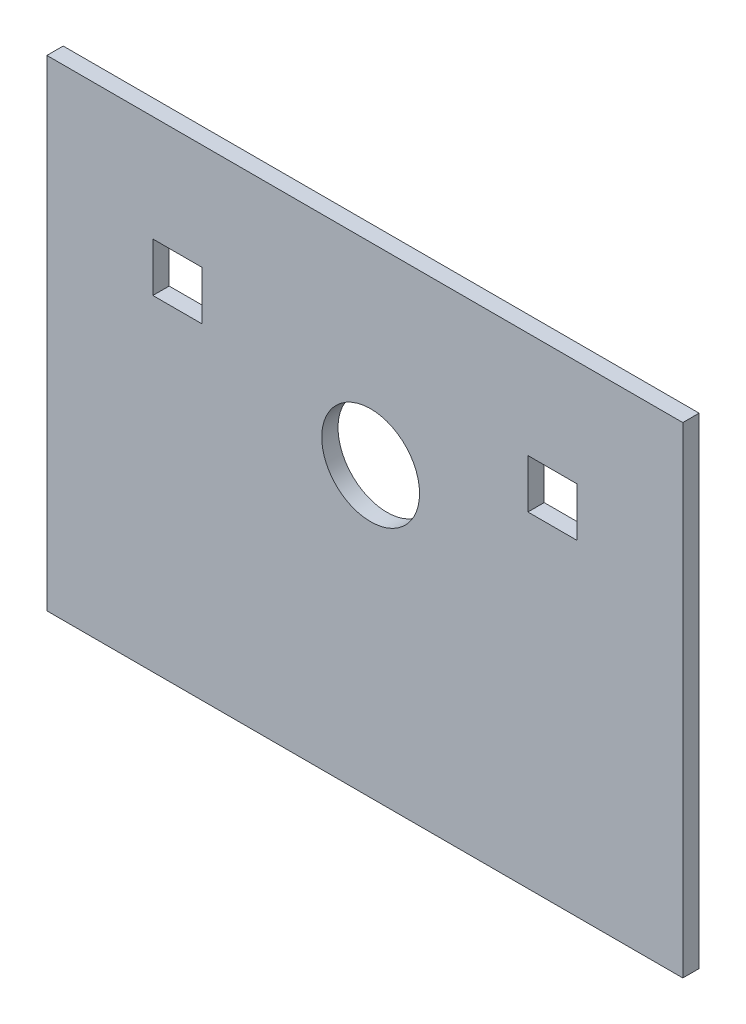
ISO-10303-21;
HEADER;
FILE_DESCRIPTION(('STEP AP214'),'2;1');
FILE_NAME('part.step','',(''),(''),'','','');
FILE_SCHEMA(('AUTOMOTIVE_DESIGN { 1 0 10303 214 1 1 1 1 }'));
ENDSEC;
DATA;
#1=APPLICATION_CONTEXT('core data for automotive mechanical design processes');
#2=APPLICATION_PROTOCOL_DEFINITION('international standard','automotive_design',2000,#1);
#3=PRODUCT_CONTEXT('',#1,'mechanical');
#4=PRODUCT('Part','Part','',(#3));
#5=PRODUCT_RELATED_PRODUCT_CATEGORY('part','',(#4));
#6=PRODUCT_DEFINITION_FORMATION('','',#4);
#7=PRODUCT_DEFINITION_CONTEXT('part definition',#1,'design');
#8=PRODUCT_DEFINITION('design','',#6,#7);
#9=PRODUCT_DEFINITION_SHAPE('','',#8);
#10=(LENGTH_UNIT() NAMED_UNIT(*) SI_UNIT(.MILLI.,.METRE.));
#11=(NAMED_UNIT(*) PLANE_ANGLE_UNIT() SI_UNIT($,.RADIAN.));
#12=(NAMED_UNIT(*) SI_UNIT($,.STERADIAN.) SOLID_ANGLE_UNIT());
#13=UNCERTAINTY_MEASURE_WITH_UNIT(LENGTH_MEASURE(1.E-05),#10,'distance_accuracy_value','');
#14=(GEOMETRIC_REPRESENTATION_CONTEXT(3) GLOBAL_UNCERTAINTY_ASSIGNED_CONTEXT((#13)) GLOBAL_UNIT_ASSIGNED_CONTEXT((#10,
#11,#12)) REPRESENTATION_CONTEXT('',''));
#15=CARTESIAN_POINT('',(0.,0.,0.));
#16=DIRECTION('',(0.,0.,1.));
#17=DIRECTION('',(1.,0.,0.));
#18=AXIS2_PLACEMENT_3D('',#15,#16,#17);
#19=CARTESIAN_POINT('',(39.,-29.5,-2.));
#20=DIRECTION('',(1.,0.,0.));
#21=DIRECTION('',(0.,0.,-1.));
#22=AXIS2_PLACEMENT_3D('',#19,#20,#21);
#23=PLANE('',#22);
#24=DIRECTION('',(0.,1.,0.));
#25=VECTOR('',#24,1.);
#26=CARTESIAN_POINT('',(39.,-29.5,0.));
#27=LINE('',#26,#25);
#28=CARTESIAN_POINT('',(39.,-29.5,0.));
#29=VERTEX_POINT('',#28);
#30=CARTESIAN_POINT('',(39.,29.5,0.));
#31=VERTEX_POINT('',#30);
#32=EDGE_CURVE('E194',#29,#31,#27,.T.);
#33=ORIENTED_EDGE('',*,*,#32,.F.);
#34=DIRECTION('',(0.,0.,1.));
#35=VECTOR('',#34,1.);
#36=CARTESIAN_POINT('',(39.,-29.5,-2.));
#37=LINE('',#36,#35);
#38=CARTESIAN_POINT('',(39.,-29.5,-2.));
#39=VERTEX_POINT('',#38);
#40=EDGE_CURVE('E11',#39,#29,#37,.T.);
#41=ORIENTED_EDGE('',*,*,#40,.F.);
#42=DIRECTION('',(0.,1.,0.));
#43=VECTOR('',#42,1.);
#44=CARTESIAN_POINT('',(39.,-29.5,-2.));
#45=LINE('',#44,#43);
#46=CARTESIAN_POINT('',(39.,29.5,-2.));
#47=VERTEX_POINT('',#46);
#48=EDGE_CURVE('E201',#39,#47,#45,.T.);
#49=ORIENTED_EDGE('',*,*,#48,.T.);
#50=DIRECTION('',(0.,0.,1.));
#51=VECTOR('',#50,1.);
#52=CARTESIAN_POINT('',(39.,29.5,-2.));
#53=LINE('',#52,#51);
#54=EDGE_CURVE('E42',#47,#31,#53,.T.);
#55=ORIENTED_EDGE('',*,*,#54,.T.);
#56=EDGE_LOOP('',(#33,#41,#49,#55));
#57=FACE_BOUND('',#56,.T.);
#58=ADVANCED_FACE('F39',(#57),#23,.T.);
#59=CARTESIAN_POINT('',(-39.,-29.5,-2.));
#60=DIRECTION('',(0.,-1.,0.));
#61=DIRECTION('',(0.,0.,-1.));
#62=AXIS2_PLACEMENT_3D('',#59,#60,#61);
#63=PLANE('',#62);
#64=DIRECTION('',(1.,0.,0.));
#65=VECTOR('',#64,1.);
#66=CARTESIAN_POINT('',(-39.,-29.5,0.));
#67=LINE('',#66,#65);
#68=CARTESIAN_POINT('',(-39.,-29.5,0.));
#69=VERTEX_POINT('',#68);
#70=EDGE_CURVE('E205',#69,#29,#67,.T.);
#71=ORIENTED_EDGE('',*,*,#70,.F.);
#72=DIRECTION('',(0.,0.,1.));
#73=VECTOR('',#72,1.);
#74=CARTESIAN_POINT('',(-39.,-29.5,-2.));
#75=LINE('',#74,#73);
#76=CARTESIAN_POINT('',(-39.,-29.5,-2.));
#77=VERTEX_POINT('',#76);
#78=EDGE_CURVE('E47',#77,#69,#75,.T.);
#79=ORIENTED_EDGE('',*,*,#78,.F.);
#80=DIRECTION('',(1.,0.,0.));
#81=VECTOR('',#80,1.);
#82=CARTESIAN_POINT('',(-39.,-29.5,-2.));
#83=LINE('',#82,#81);
#84=EDGE_CURVE('E211',#77,#39,#83,.T.);
#85=ORIENTED_EDGE('',*,*,#84,.T.);
#86=ORIENTED_EDGE('',*,*,#40,.T.);
#87=EDGE_LOOP('',(#71,#79,#85,#86));
#88=FACE_BOUND('',#87,.T.);
#89=ADVANCED_FACE('F237',(#88),#63,.T.);
#90=CARTESIAN_POINT('',(-39.,-29.5,-2.));
#91=DIRECTION('',(-1.,0.,0.));
#92=DIRECTION('',(0.,0.,1.));
#93=AXIS2_PLACEMENT_3D('',#90,#91,#92);
#94=PLANE('',#93);
#95=DIRECTION('',(0.,-1.,0.));
#96=VECTOR('',#95,1.);
#97=CARTESIAN_POINT('',(-39.,-29.5,0.));
#98=LINE('',#97,#96);
#99=CARTESIAN_POINT('',(-39.,29.5,0.));
#100=VERTEX_POINT('',#99);
#101=EDGE_CURVE('E219',#100,#69,#98,.T.);
#102=ORIENTED_EDGE('',*,*,#101,.F.);
#103=DIRECTION('',(0.,0.,1.));
#104=VECTOR('',#103,1.);
#105=CARTESIAN_POINT('',(-39.,29.5,-2.));
#106=LINE('',#105,#104);
#107=CARTESIAN_POINT('',(-39.,29.5,-2.));
#108=VERTEX_POINT('',#107);
#109=EDGE_CURVE('E224',#108,#100,#106,.T.);
#110=ORIENTED_EDGE('',*,*,#109,.F.);
#111=DIRECTION('',(0.,-1.,0.));
#112=VECTOR('',#111,1.);
#113=CARTESIAN_POINT('',(-39.,-29.5,-2.));
#114=LINE('',#113,#112);
#115=EDGE_CURVE('E208',#108,#77,#114,.T.);
#116=ORIENTED_EDGE('',*,*,#115,.T.);
#117=ORIENTED_EDGE('',*,*,#78,.T.);
#118=EDGE_LOOP('',(#102,#110,#116,#117));
#119=FACE_BOUND('',#118,.T.);
#120=ADVANCED_FACE('F242',(#119),#94,.T.);
#121=CARTESIAN_POINT('',(-39.,29.5,-2.));
#122=DIRECTION('',(0.,1.,0.));
#123=DIRECTION('',(0.,0.,1.));
#124=AXIS2_PLACEMENT_3D('',#121,#122,#123);
#125=PLANE('',#124);
#126=DIRECTION('',(-1.,0.,0.));
#127=VECTOR('',#126,1.);
#128=CARTESIAN_POINT('',(-39.,29.5,0.));
#129=LINE('',#128,#127);
#130=EDGE_CURVE('E216',#31,#100,#129,.T.);
#131=ORIENTED_EDGE('',*,*,#130,.F.);
#132=ORIENTED_EDGE('',*,*,#54,.F.);
#133=DIRECTION('',(-1.,0.,0.));
#134=VECTOR('',#133,1.);
#135=CARTESIAN_POINT('',(-39.,29.5,-2.));
#136=LINE('',#135,#134);
#137=EDGE_CURVE('E204',#47,#108,#136,.T.);
#138=ORIENTED_EDGE('',*,*,#137,.T.);
#139=ORIENTED_EDGE('',*,*,#109,.T.);
#140=EDGE_LOOP('',(#131,#132,#138,#139));
#141=FACE_BOUND('',#140,.T.);
#142=ADVANCED_FACE('F232',(#141),#125,.T.);
#143=CARTESIAN_POINT('',(0.,0.,-2.));
#144=DIRECTION('',(0.,0.,-1.));
#145=DIRECTION('',(-1.,0.,0.));
#146=AXIS2_PLACEMENT_3D('',#143,#144,#145);
#147=PLANE('',#146);
#148=CARTESIAN_POINT('',(0.71,5.82000000000001,-2.));
#149=DIRECTION('',(0.,0.,1.));
#150=DIRECTION('',(1.,0.,0.));
#151=AXIS2_PLACEMENT_3D('',#148,#149,#150);
#152=CIRCLE('',#151,6.0003838266872);
#153=CARTESIAN_POINT('',(6.7103838266872,5.82000000000001,-2.));
#154=VERTEX_POINT('',#153);
#155=EDGE_CURVE('E159',#154,#154,#152,.T.);
#156=ORIENTED_EDGE('',*,*,#155,.T.);
#157=EDGE_LOOP('',(#156));
#158=FACE_BOUND('',#157,.T.);
#159=DIRECTION('',(0.,1.,0.));
#160=VECTOR('',#159,1.);
#161=CARTESIAN_POINT('',(26.,10.5,-2.));
#162=LINE('',#161,#160);
#163=CARTESIAN_POINT('',(26.,10.5,-2.));
#164=VERTEX_POINT('',#163);
#165=CARTESIAN_POINT('',(26.,16.5,-2.));
#166=VERTEX_POINT('',#165);
#167=EDGE_CURVE('E130',#164,#166,#162,.T.);
#168=ORIENTED_EDGE('',*,*,#167,.T.);
#169=DIRECTION('',(-1.,0.,0.));
#170=VECTOR('',#169,1.);
#171=CARTESIAN_POINT('',(20.,16.5,-2.));
#172=LINE('',#171,#170);
#173=CARTESIAN_POINT('',(20.,16.5,-2.));
#174=VERTEX_POINT('',#173);
#175=EDGE_CURVE('E139',#166,#174,#172,.T.);
#176=ORIENTED_EDGE('',*,*,#175,.T.);
#177=DIRECTION('',(0.,-1.,0.));
#178=VECTOR('',#177,1.);
#179=CARTESIAN_POINT('',(20.,10.5,-2.));
#180=LINE('',#179,#178);
#181=CARTESIAN_POINT('',(20.,10.5,-2.));
#182=VERTEX_POINT('',#181);
#183=EDGE_CURVE('E55',#174,#182,#180,.T.);
#184=ORIENTED_EDGE('',*,*,#183,.T.);
#185=DIRECTION('',(1.,0.,0.));
#186=VECTOR('',#185,1.);
#187=CARTESIAN_POINT('',(20.,10.5,-2.));
#188=LINE('',#187,#186);
#189=EDGE_CURVE('E136',#182,#164,#188,.T.);
#190=ORIENTED_EDGE('',*,*,#189,.T.);
#191=EDGE_LOOP('',(#168,#176,#184,#190));
#192=FACE_BOUND('',#191,.T.);
#193=DIRECTION('',(0.,1.,0.));
#194=VECTOR('',#193,1.);
#195=CARTESIAN_POINT('',(-20.,10.5,-2.));
#196=LINE('',#195,#194);
#197=CARTESIAN_POINT('',(-20.,10.5,-2.));
#198=VERTEX_POINT('',#197);
#199=CARTESIAN_POINT('',(-20.,16.5,-2.));
#200=VERTEX_POINT('',#199);
#201=EDGE_CURVE('E169',#198,#200,#196,.T.);
#202=ORIENTED_EDGE('',*,*,#201,.T.);
#203=DIRECTION('',(-1.,0.,0.));
#204=VECTOR('',#203,1.);
#205=CARTESIAN_POINT('',(-26.,16.5,-2.));
#206=LINE('',#205,#204);
#207=CARTESIAN_POINT('',(-26.,16.5,-2.));
#208=VERTEX_POINT('',#207);
#209=EDGE_CURVE('E172',#200,#208,#206,.T.);
#210=ORIENTED_EDGE('',*,*,#209,.T.);
#211=DIRECTION('',(0.,-1.,0.));
#212=VECTOR('',#211,1.);
#213=CARTESIAN_POINT('',(-26.,10.5,-2.));
#214=LINE('',#213,#212);
#215=CARTESIAN_POINT('',(-26.,10.5,-2.));
#216=VERTEX_POINT('',#215);
#217=EDGE_CURVE('E176',#208,#216,#214,.T.);
#218=ORIENTED_EDGE('',*,*,#217,.T.);
#219=DIRECTION('',(1.,0.,0.));
#220=VECTOR('',#219,1.);
#221=CARTESIAN_POINT('',(-26.,10.5,-2.));
#222=LINE('',#221,#220);
#223=EDGE_CURVE('E179',#216,#198,#222,.T.);
#224=ORIENTED_EDGE('',*,*,#223,.T.);
#225=EDGE_LOOP('',(#202,#210,#218,#224));
#226=FACE_BOUND('',#225,.T.);
#227=ORIENTED_EDGE('',*,*,#48,.F.);
#228=ORIENTED_EDGE('',*,*,#84,.F.);
#229=ORIENTED_EDGE('',*,*,#115,.F.);
#230=ORIENTED_EDGE('',*,*,#137,.F.);
#231=EDGE_LOOP('',(#227,#228,#229,#230));
#232=FACE_BOUND('',#231,.T.);
#233=ADVANCED_FACE('F143',(#158,#192,#226,#232),#147,.T.);
#234=CARTESIAN_POINT('',(0.,0.,0.));
#235=DIRECTION('',(0.,0.,-1.));
#236=DIRECTION('',(-1.,0.,0.));
#237=AXIS2_PLACEMENT_3D('',#234,#235,#236);
#238=PLANE('',#237);
#239=CARTESIAN_POINT('',(0.71,5.82000000000001,0.));
#240=DIRECTION('',(0.,0.,1.));
#241=DIRECTION('',(1.,0.,0.));
#242=AXIS2_PLACEMENT_3D('',#239,#240,#241);
#243=CIRCLE('',#242,6.0003838266872);
#244=CARTESIAN_POINT('',(6.7103838266872,5.82000000000001,0.));
#245=VERTEX_POINT('',#244);
#246=EDGE_CURVE('E152',#245,#245,#243,.T.);
#247=ORIENTED_EDGE('',*,*,#246,.F.);
#248=EDGE_LOOP('',(#247));
#249=FACE_BOUND('',#248,.T.);
#250=DIRECTION('',(-1.,0.,0.));
#251=VECTOR('',#250,1.);
#252=CARTESIAN_POINT('',(20.,16.5,0.));
#253=LINE('',#252,#251);
#254=CARTESIAN_POINT('',(26.,16.5,0.));
#255=VERTEX_POINT('',#254);
#256=CARTESIAN_POINT('',(20.,16.5,0.));
#257=VERTEX_POINT('',#256);
#258=EDGE_CURVE('E158',#255,#257,#253,.T.);
#259=ORIENTED_EDGE('',*,*,#258,.F.);
#260=DIRECTION('',(0.,1.,0.));
#261=VECTOR('',#260,1.);
#262=CARTESIAN_POINT('',(26.,10.5,0.));
#263=LINE('',#262,#261);
#264=CARTESIAN_POINT('',(26.,10.5,0.));
#265=VERTEX_POINT('',#264);
#266=EDGE_CURVE('E63',#265,#255,#263,.T.);
#267=ORIENTED_EDGE('',*,*,#266,.F.);
#268=DIRECTION('',(1.,0.,0.));
#269=VECTOR('',#268,1.);
#270=CARTESIAN_POINT('',(20.,10.5,0.));
#271=LINE('',#270,#269);
#272=CARTESIAN_POINT('',(20.,10.5,0.));
#273=VERTEX_POINT('',#272);
#274=EDGE_CURVE('E146',#273,#265,#271,.T.);
#275=ORIENTED_EDGE('',*,*,#274,.F.);
#276=DIRECTION('',(0.,-1.,0.));
#277=VECTOR('',#276,1.);
#278=CARTESIAN_POINT('',(20.,10.5,0.));
#279=LINE('',#278,#277);
#280=EDGE_CURVE('E149',#257,#273,#279,.T.);
#281=ORIENTED_EDGE('',*,*,#280,.F.);
#282=EDGE_LOOP('',(#259,#267,#275,#281));
#283=FACE_BOUND('',#282,.T.);
#284=DIRECTION('',(-1.,0.,0.));
#285=VECTOR('',#284,1.);
#286=CARTESIAN_POINT('',(-26.,16.5,0.));
#287=LINE('',#286,#285);
#288=CARTESIAN_POINT('',(-20.,16.5,0.));
#289=VERTEX_POINT('',#288);
#290=CARTESIAN_POINT('',(-26.,16.5,0.));
#291=VERTEX_POINT('',#290);
#292=EDGE_CURVE('E184',#289,#291,#287,.T.);
#293=ORIENTED_EDGE('',*,*,#292,.F.);
#294=DIRECTION('',(0.,1.,0.));
#295=VECTOR('',#294,1.);
#296=CARTESIAN_POINT('',(-20.,10.5,0.));
#297=LINE('',#296,#295);
#298=CARTESIAN_POINT('',(-20.,10.5,0.));
#299=VERTEX_POINT('',#298);
#300=EDGE_CURVE('E165',#299,#289,#297,.T.);
#301=ORIENTED_EDGE('',*,*,#300,.F.);
#302=DIRECTION('',(1.,0.,0.));
#303=VECTOR('',#302,1.);
#304=CARTESIAN_POINT('',(-26.,10.5,0.));
#305=LINE('',#304,#303);
#306=CARTESIAN_POINT('',(-26.,10.5,0.));
#307=VERTEX_POINT('',#306);
#308=EDGE_CURVE('E173',#307,#299,#305,.T.);
#309=ORIENTED_EDGE('',*,*,#308,.F.);
#310=DIRECTION('',(0.,-1.,0.));
#311=VECTOR('',#310,1.);
#312=CARTESIAN_POINT('',(-26.,10.5,0.));
#313=LINE('',#312,#311);
#314=EDGE_CURVE('E187',#291,#307,#313,.T.);
#315=ORIENTED_EDGE('',*,*,#314,.F.);
#316=EDGE_LOOP('',(#293,#301,#309,#315));
#317=FACE_BOUND('',#316,.T.);
#318=ORIENTED_EDGE('',*,*,#32,.T.);
#319=ORIENTED_EDGE('',*,*,#130,.T.);
#320=ORIENTED_EDGE('',*,*,#101,.T.);
#321=ORIENTED_EDGE('',*,*,#70,.T.);
#322=EDGE_LOOP('',(#318,#319,#320,#321));
#323=FACE_BOUND('',#322,.T.);
#324=ADVANCED_FACE('F234',(#249,#283,#317,#323),#238,.F.);
#325=CARTESIAN_POINT('',(-20.,10.5,-2.));
#326=DIRECTION('',(1.,0.,0.));
#327=DIRECTION('',(0.,0.,-1.));
#328=AXIS2_PLACEMENT_3D('',#325,#326,#327);
#329=PLANE('',#328);
#330=ORIENTED_EDGE('',*,*,#300,.T.);
#331=DIRECTION('',(0.,0.,1.));
#332=VECTOR('',#331,1.);
#333=CARTESIAN_POINT('',(-20.,16.5,-2.));
#334=LINE('',#333,#332);
#335=EDGE_CURVE('E182',#200,#289,#334,.T.);
#336=ORIENTED_EDGE('',*,*,#335,.F.);
#337=ORIENTED_EDGE('',*,*,#201,.F.);
#338=DIRECTION('',(0.,0.,1.));
#339=VECTOR('',#338,1.);
#340=CARTESIAN_POINT('',(-20.,10.5,-2.));
#341=LINE('',#340,#339);
#342=EDGE_CURVE('E192',#198,#299,#341,.T.);
#343=ORIENTED_EDGE('',*,*,#342,.T.);
#344=EDGE_LOOP('',(#330,#336,#337,#343));
#345=FACE_BOUND('',#344,.T.);
#346=ADVANCED_FACE('F287',(#345),#329,.F.);
#347=CARTESIAN_POINT('',(-26.,10.5,-2.));
#348=DIRECTION('',(0.,-1.,0.));
#349=DIRECTION('',(0.,0.,-1.));
#350=AXIS2_PLACEMENT_3D('',#347,#348,#349);
#351=PLANE('',#350);
#352=ORIENTED_EDGE('',*,*,#308,.T.);
#353=ORIENTED_EDGE('',*,*,#342,.F.);
#354=ORIENTED_EDGE('',*,*,#223,.F.);
#355=DIRECTION('',(0.,0.,1.));
#356=VECTOR('',#355,1.);
#357=CARTESIAN_POINT('',(-26.,10.5,-2.));
#358=LINE('',#357,#356);
#359=EDGE_CURVE('E195',#216,#307,#358,.T.);
#360=ORIENTED_EDGE('',*,*,#359,.T.);
#361=EDGE_LOOP('',(#352,#353,#354,#360));
#362=FACE_BOUND('',#361,.T.);
#363=ADVANCED_FACE('F297',(#362),#351,.F.);
#364=CARTESIAN_POINT('',(-26.,10.5,-2.));
#365=DIRECTION('',(-1.,0.,0.));
#366=DIRECTION('',(0.,0.,1.));
#367=AXIS2_PLACEMENT_3D('',#364,#365,#366);
#368=PLANE('',#367);
#369=ORIENTED_EDGE('',*,*,#314,.T.);
#370=ORIENTED_EDGE('',*,*,#359,.F.);
#371=ORIENTED_EDGE('',*,*,#217,.F.);
#372=DIRECTION('',(0.,0.,1.));
#373=VECTOR('',#372,1.);
#374=CARTESIAN_POINT('',(-26.,16.5,-2.));
#375=LINE('',#374,#373);
#376=EDGE_CURVE('E197',#208,#291,#375,.T.);
#377=ORIENTED_EDGE('',*,*,#376,.T.);
#378=EDGE_LOOP('',(#369,#370,#371,#377));
#379=FACE_BOUND('',#378,.T.);
#380=ADVANCED_FACE('F307',(#379),#368,.F.);
#381=CARTESIAN_POINT('',(-26.,16.5,-2.));
#382=DIRECTION('',(0.,1.,0.));
#383=DIRECTION('',(0.,0.,1.));
#384=AXIS2_PLACEMENT_3D('',#381,#382,#383);
#385=PLANE('',#384);
#386=ORIENTED_EDGE('',*,*,#292,.T.);
#387=ORIENTED_EDGE('',*,*,#376,.F.);
#388=ORIENTED_EDGE('',*,*,#209,.F.);
#389=ORIENTED_EDGE('',*,*,#335,.T.);
#390=EDGE_LOOP('',(#386,#387,#388,#389));
#391=FACE_BOUND('',#390,.T.);
#392=ADVANCED_FACE('F317',(#391),#385,.F.);
#393=CARTESIAN_POINT('',(26.,10.5,-2.));
#394=DIRECTION('',(1.,0.,0.));
#395=DIRECTION('',(0.,0.,-1.));
#396=AXIS2_PLACEMENT_3D('',#393,#394,#395);
#397=PLANE('',#396);
#398=ORIENTED_EDGE('',*,*,#266,.T.);
#399=DIRECTION('',(0.,0.,1.));
#400=VECTOR('',#399,1.);
#401=CARTESIAN_POINT('',(26.,16.5,-2.));
#402=LINE('',#401,#400);
#403=EDGE_CURVE('E126',#166,#255,#402,.T.);
#404=ORIENTED_EDGE('',*,*,#403,.F.);
#405=ORIENTED_EDGE('',*,*,#167,.F.);
#406=DIRECTION('',(0.,0.,1.));
#407=VECTOR('',#406,1.);
#408=CARTESIAN_POINT('',(26.,10.5,-2.));
#409=LINE('',#408,#407);
#410=EDGE_CURVE('E163',#164,#265,#409,.T.);
#411=ORIENTED_EDGE('',*,*,#410,.T.);
#412=EDGE_LOOP('',(#398,#404,#405,#411));
#413=FACE_BOUND('',#412,.T.);
#414=ADVANCED_FACE('F128',(#413),#397,.F.);
#415=CARTESIAN_POINT('',(20.,10.5,-2.));
#416=DIRECTION('',(0.,-1.,0.));
#417=DIRECTION('',(0.,0.,-1.));
#418=AXIS2_PLACEMENT_3D('',#415,#416,#417);
#419=PLANE('',#418);
#420=ORIENTED_EDGE('',*,*,#274,.T.);
#421=ORIENTED_EDGE('',*,*,#410,.F.);
#422=ORIENTED_EDGE('',*,*,#189,.F.);
#423=DIRECTION('',(0.,0.,1.));
#424=VECTOR('',#423,1.);
#425=CARTESIAN_POINT('',(20.,10.5,-2.));
#426=LINE('',#425,#424);
#427=EDGE_CURVE('E166',#182,#273,#426,.T.);
#428=ORIENTED_EDGE('',*,*,#427,.T.);
#429=EDGE_LOOP('',(#420,#421,#422,#428));
#430=FACE_BOUND('',#429,.T.);
#431=ADVANCED_FACE('F336',(#430),#419,.F.);
#432=CARTESIAN_POINT('',(20.,10.5,-2.));
#433=DIRECTION('',(-1.,0.,0.));
#434=DIRECTION('',(0.,0.,1.));
#435=AXIS2_PLACEMENT_3D('',#432,#433,#434);
#436=PLANE('',#435);
#437=ORIENTED_EDGE('',*,*,#280,.T.);
#438=ORIENTED_EDGE('',*,*,#427,.F.);
#439=ORIENTED_EDGE('',*,*,#183,.F.);
#440=DIRECTION('',(0.,0.,1.));
#441=VECTOR('',#440,1.);
#442=CARTESIAN_POINT('',(20.,16.5,-2.));
#443=LINE('',#442,#441);
#444=EDGE_CURVE('E135',#174,#257,#443,.T.);
#445=ORIENTED_EDGE('',*,*,#444,.T.);
#446=EDGE_LOOP('',(#437,#438,#439,#445));
#447=FACE_BOUND('',#446,.T.);
#448=ADVANCED_FACE('F345',(#447),#436,.F.);
#449=CARTESIAN_POINT('',(20.,16.5,-2.));
#450=DIRECTION('',(0.,1.,0.));
#451=DIRECTION('',(0.,0.,1.));
#452=AXIS2_PLACEMENT_3D('',#449,#450,#451);
#453=PLANE('',#452);
#454=ORIENTED_EDGE('',*,*,#258,.T.);
#455=ORIENTED_EDGE('',*,*,#444,.F.);
#456=ORIENTED_EDGE('',*,*,#175,.F.);
#457=ORIENTED_EDGE('',*,*,#403,.T.);
#458=EDGE_LOOP('',(#454,#455,#456,#457));
#459=FACE_BOUND('',#458,.T.);
#460=ADVANCED_FACE('F140',(#459),#453,.F.);
#461=CARTESIAN_POINT('',(0.71,5.82000000000001,-2.));
#462=DIRECTION('',(0.,0.,1.));
#463=DIRECTION('',(1.,0.,0.));
#464=AXIS2_PLACEMENT_3D('',#461,#462,#463);
#465=CYLINDRICAL_SURFACE('',#464,6.0003838266872);
#466=ORIENTED_EDGE('',*,*,#155,.F.);
#467=EDGE_LOOP('',(#466));
#468=FACE_BOUND('',#467,.T.);
#469=ORIENTED_EDGE('',*,*,#246,.T.);
#470=EDGE_LOOP('',(#469));
#471=FACE_BOUND('',#470,.T.);
#472=ADVANCED_FACE('F363',(#468,#471),#465,.F.);
#473=CLOSED_SHELL('',(#58,#89,#120,#142,#233,#324,#346,#363,#380,#392,#414,#431,#448,#460,#472));
#474=MANIFOLD_SOLID_BREP('B2',#473);
#475=ADVANCED_BREP_SHAPE_REPRESENTATION('',(#18,#474),#14);
#476=SHAPE_DEFINITION_REPRESENTATION(#9,#475);
ENDSEC;
END-ISO-10303-21;
